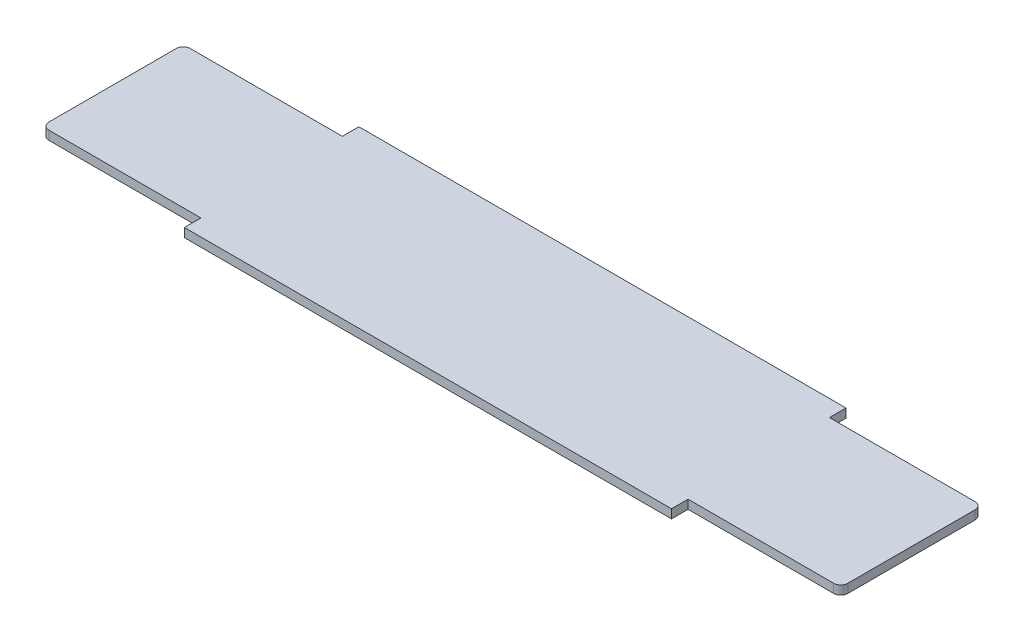
ISO-10303-21;
HEADER;
FILE_DESCRIPTION(('STEP AP214'),'2;1');
FILE_NAME('part.step','',(''),(''),'','','');
FILE_SCHEMA(('AUTOMOTIVE_DESIGN { 1 0 10303 214 1 1 1 1 }'));
ENDSEC;
DATA;
#1=APPLICATION_CONTEXT('core data for automotive mechanical design processes');
#2=APPLICATION_PROTOCOL_DEFINITION('international standard','automotive_design',2000,#1);
#3=PRODUCT_CONTEXT('',#1,'mechanical');
#4=PRODUCT('Part','Part','',(#3));
#5=PRODUCT_RELATED_PRODUCT_CATEGORY('part','',(#4));
#6=PRODUCT_DEFINITION_FORMATION('','',#4);
#7=PRODUCT_DEFINITION_CONTEXT('part definition',#1,'design');
#8=PRODUCT_DEFINITION('design','',#6,#7);
#9=PRODUCT_DEFINITION_SHAPE('','',#8);
#10=(LENGTH_UNIT() NAMED_UNIT(*) SI_UNIT(.MILLI.,.METRE.));
#11=(NAMED_UNIT(*) PLANE_ANGLE_UNIT() SI_UNIT($,.RADIAN.));
#12=(NAMED_UNIT(*) SI_UNIT($,.STERADIAN.) SOLID_ANGLE_UNIT());
#13=UNCERTAINTY_MEASURE_WITH_UNIT(LENGTH_MEASURE(1.E-05),#10,'distance_accuracy_value','');
#14=(GEOMETRIC_REPRESENTATION_CONTEXT(3) GLOBAL_UNCERTAINTY_ASSIGNED_CONTEXT((#13)) GLOBAL_UNIT_ASSIGNED_CONTEXT((#10,
#11,#12)) REPRESENTATION_CONTEXT('',''));
#15=CARTESIAN_POINT('',(0.,0.,0.));
#16=DIRECTION('',(0.,0.,1.));
#17=DIRECTION('',(1.,0.,0.));
#18=AXIS2_PLACEMENT_3D('',#15,#16,#17);
#19=CARTESIAN_POINT('',(0.,3.175,0.));
#20=DIRECTION('',(0.,0.,-1.));
#21=DIRECTION('',(-1.,0.,0.));
#22=AXIS2_PLACEMENT_3D('',#19,#20,#21);
#23=PLANE('',#22);
#24=DIRECTION('',(1.,0.,0.));
#25=VECTOR('',#24,1.);
#26=CARTESIAN_POINT('',(0.,0.,0.));
#27=LINE('',#26,#25);
#28=CARTESIAN_POINT('',(-54.864,0.,0.));
#29=VERTEX_POINT('',#28);
#30=CARTESIAN_POINT('',(-2.54,0.,0.));
#31=VERTEX_POINT('',#30);
#32=EDGE_CURVE('E246',#29,#31,#27,.T.);
#33=ORIENTED_EDGE('',*,*,#32,.T.);
#34=DIRECTION('',(0.,-1.,0.));
#35=VECTOR('',#34,1.);
#36=CARTESIAN_POINT('',(-2.54,3.175,0.));
#37=LINE('',#36,#35);
#38=CARTESIAN_POINT('',(-2.54,3.175,0.));
#39=VERTEX_POINT('',#38);
#40=EDGE_CURVE('E225',#31,#39,#37,.F.);
#41=ORIENTED_EDGE('',*,*,#40,.T.);
#42=DIRECTION('',(1.,0.,0.));
#43=VECTOR('',#42,1.);
#44=CARTESIAN_POINT('',(0.,3.175,0.));
#45=LINE('',#44,#43);
#46=CARTESIAN_POINT('',(-54.864,3.175,0.));
#47=VERTEX_POINT('',#46);
#48=EDGE_CURVE('E209',#47,#39,#45,.T.);
#49=ORIENTED_EDGE('',*,*,#48,.F.);
#50=DIRECTION('',(0.,1.,0.));
#51=VECTOR('',#50,1.);
#52=CARTESIAN_POINT('',(-54.864,-175.10689996959,0.));
#53=LINE('',#52,#51);
#54=EDGE_CURVE('E280',#29,#47,#53,.T.);
#55=ORIENTED_EDGE('',*,*,#54,.F.);
#56=EDGE_LOOP('',(#33,#41,#49,#55));
#57=FACE_BOUND('',#56,.T.);
#58=ADVANCED_FACE('F32',(#57),#23,.F.);
#59=CARTESIAN_POINT('',(0.,3.175,-50.8));
#60=DIRECTION('',(0.,0.,1.));
#61=DIRECTION('',(1.,0.,0.));
#62=AXIS2_PLACEMENT_3D('',#59,#60,#61);
#63=PLANE('',#62);
#64=DIRECTION('',(-1.,0.,0.));
#65=VECTOR('',#64,1.);
#66=CARTESIAN_POINT('',(0.,0.,-50.8));
#67=LINE('',#66,#65);
#68=CARTESIAN_POINT('',(-229.87,0.,-50.8));
#69=VERTEX_POINT('',#68);
#70=CARTESIAN_POINT('',(-284.48,0.,-50.8));
#71=VERTEX_POINT('',#70);
#72=EDGE_CURVE('E184',#69,#71,#67,.T.);
#73=ORIENTED_EDGE('',*,*,#72,.T.);
#74=DIRECTION('',(0.,-1.,0.));
#75=VECTOR('',#74,1.);
#76=CARTESIAN_POINT('',(-284.48,3.175,-50.8));
#77=LINE('',#76,#75);
#78=CARTESIAN_POINT('',(-284.48,3.175,-50.8));
#79=VERTEX_POINT('',#78);
#80=EDGE_CURVE('E11',#71,#79,#77,.F.);
#81=ORIENTED_EDGE('',*,*,#80,.T.);
#82=DIRECTION('',(-1.,0.,0.));
#83=VECTOR('',#82,1.);
#84=CARTESIAN_POINT('',(0.,3.175,-50.8));
#85=LINE('',#84,#83);
#86=CARTESIAN_POINT('',(-229.87,3.175,-50.8));
#87=VERTEX_POINT('',#86);
#88=EDGE_CURVE('E198',#87,#79,#85,.T.);
#89=ORIENTED_EDGE('',*,*,#88,.F.);
#90=DIRECTION('',(0.,1.,0.));
#91=VECTOR('',#90,1.);
#92=CARTESIAN_POINT('',(-229.87,-175.10689996959,-50.8));
#93=LINE('',#92,#91);
#94=EDGE_CURVE('E201',#69,#87,#93,.T.);
#95=ORIENTED_EDGE('',*,*,#94,.F.);
#96=EDGE_LOOP('',(#73,#81,#89,#95));
#97=FACE_BOUND('',#96,.T.);
#98=ADVANCED_FACE('F352',(#97),#63,.F.);
#99=CARTESIAN_POINT('',(0.,3.175,0.));
#100=DIRECTION('',(-1.,0.,0.));
#101=DIRECTION('',(0.,0.,1.));
#102=AXIS2_PLACEMENT_3D('',#99,#100,#101);
#103=PLANE('',#102);
#104=DIRECTION('',(0.,0.,-1.));
#105=VECTOR('',#104,1.);
#106=CARTESIAN_POINT('',(0.,0.,0.));
#107=LINE('',#106,#105);
#108=CARTESIAN_POINT('',(0.,0.,-2.54));
#109=VERTEX_POINT('',#108);
#110=CARTESIAN_POINT('',(0.,0.,-48.26));
#111=VERTEX_POINT('',#110);
#112=EDGE_CURVE('E191',#109,#111,#107,.T.);
#113=ORIENTED_EDGE('',*,*,#112,.T.);
#114=DIRECTION('',(0.,-1.,0.));
#115=VECTOR('',#114,1.);
#116=CARTESIAN_POINT('',(0.,3.175,-48.26));
#117=LINE('',#116,#115);
#118=CARTESIAN_POINT('',(0.,3.175,-48.26));
#119=VERTEX_POINT('',#118);
#120=EDGE_CURVE('E325',#111,#119,#117,.F.);
#121=ORIENTED_EDGE('',*,*,#120,.T.);
#122=DIRECTION('',(0.,0.,-1.));
#123=VECTOR('',#122,1.);
#124=CARTESIAN_POINT('',(0.,3.175,0.));
#125=LINE('',#124,#123);
#126=CARTESIAN_POINT('',(0.,3.175,-2.54));
#127=VERTEX_POINT('',#126);
#128=EDGE_CURVE('E200',#127,#119,#125,.T.);
#129=ORIENTED_EDGE('',*,*,#128,.F.);
#130=DIRECTION('',(0.,-1.,0.));
#131=VECTOR('',#130,1.);
#132=CARTESIAN_POINT('',(0.,3.175,-2.54));
#133=LINE('',#132,#131);
#134=EDGE_CURVE('E322',#127,#109,#133,.T.);
#135=ORIENTED_EDGE('',*,*,#134,.T.);
#136=EDGE_LOOP('',(#113,#121,#129,#135));
#137=FACE_BOUND('',#136,.T.);
#138=ADVANCED_FACE('F340',(#137),#103,.F.);
#139=CARTESIAN_POINT('',(-2.54,3.175,-50.8));
#140=VERTEX_POINT('',#139);
#141=CARTESIAN_POINT('',(-54.864,3.175,-50.8));
#142=VERTEX_POINT('',#141);
#143=EDGE_CURVE('E185',#140,#142,#85,.T.);
#144=ORIENTED_EDGE('',*,*,#143,.F.);
#145=DIRECTION('',(0.,-1.,0.));
#146=VECTOR('',#145,1.);
#147=CARTESIAN_POINT('',(-2.54,3.175,-50.8));
#148=LINE('',#147,#146);
#149=CARTESIAN_POINT('',(-2.54,0.,-50.8));
#150=VERTEX_POINT('',#149);
#151=EDGE_CURVE('E218',#140,#150,#148,.T.);
#152=ORIENTED_EDGE('',*,*,#151,.T.);
#153=CARTESIAN_POINT('',(-54.864,0.,-50.8));
#154=VERTEX_POINT('',#153);
#155=EDGE_CURVE('E180',#150,#154,#67,.T.);
#156=ORIENTED_EDGE('',*,*,#155,.T.);
#157=DIRECTION('',(0.,1.,0.));
#158=VECTOR('',#157,1.);
#159=CARTESIAN_POINT('',(-54.864,-175.10689996959,-50.8));
#160=LINE('',#159,#158);
#161=EDGE_CURVE('E259',#154,#142,#160,.T.);
#162=ORIENTED_EDGE('',*,*,#161,.T.);
#163=EDGE_LOOP('',(#144,#152,#156,#162));
#164=FACE_BOUND('',#163,.T.);
#165=ADVANCED_FACE('F312',(#164),#63,.F.);
#166=CARTESIAN_POINT('',(-287.02,3.175,0.));
#167=DIRECTION('',(1.,0.,0.));
#168=DIRECTION('',(0.,0.,-1.));
#169=AXIS2_PLACEMENT_3D('',#166,#167,#168);
#170=PLANE('',#169);
#171=DIRECTION('',(0.,0.,1.));
#172=VECTOR('',#171,1.);
#173=CARTESIAN_POINT('',(-287.02,0.,0.));
#174=LINE('',#173,#172);
#175=CARTESIAN_POINT('',(-287.02,0.,-48.26));
#176=VERTEX_POINT('',#175);
#177=CARTESIAN_POINT('',(-287.02,0.,-2.53999999999997));
#178=VERTEX_POINT('',#177);
#179=EDGE_CURVE('E183',#176,#178,#174,.T.);
#180=ORIENTED_EDGE('',*,*,#179,.T.);
#181=DIRECTION('',(0.,-1.,0.));
#182=VECTOR('',#181,1.);
#183=CARTESIAN_POINT('',(-287.02,3.175,-2.53999999999997));
#184=LINE('',#183,#182);
#185=CARTESIAN_POINT('',(-287.02,3.175,-2.53999999999997));
#186=VERTEX_POINT('',#185);
#187=EDGE_CURVE('E53',#178,#186,#184,.F.);
#188=ORIENTED_EDGE('',*,*,#187,.T.);
#189=DIRECTION('',(0.,0.,1.));
#190=VECTOR('',#189,1.);
#191=CARTESIAN_POINT('',(-287.02,3.175,0.));
#192=LINE('',#191,#190);
#193=CARTESIAN_POINT('',(-287.02,3.175,-48.26));
#194=VERTEX_POINT('',#193);
#195=EDGE_CURVE('E207',#194,#186,#192,.T.);
#196=ORIENTED_EDGE('',*,*,#195,.F.);
#197=DIRECTION('',(0.,-1.,0.));
#198=VECTOR('',#197,1.);
#199=CARTESIAN_POINT('',(-287.02,3.175,-48.26));
#200=LINE('',#199,#198);
#201=EDGE_CURVE('E229',#194,#176,#200,.T.);
#202=ORIENTED_EDGE('',*,*,#201,.T.);
#203=EDGE_LOOP('',(#180,#188,#196,#202));
#204=FACE_BOUND('',#203,.T.);
#205=ADVANCED_FACE('F244',(#204),#170,.F.);
#206=CARTESIAN_POINT('',(-284.48,3.175,0.));
#207=VERTEX_POINT('',#206);
#208=CARTESIAN_POINT('',(-229.87,3.175,0.));
#209=VERTEX_POINT('',#208);
#210=EDGE_CURVE('E171',#207,#209,#45,.T.);
#211=ORIENTED_EDGE('',*,*,#210,.F.);
#212=DIRECTION('',(0.,-1.,0.));
#213=VECTOR('',#212,1.);
#214=CARTESIAN_POINT('',(-284.48,3.175,0.));
#215=LINE('',#214,#213);
#216=CARTESIAN_POINT('',(-284.48,0.,0.));
#217=VERTEX_POINT('',#216);
#218=EDGE_CURVE('E221',#207,#217,#215,.T.);
#219=ORIENTED_EDGE('',*,*,#218,.T.);
#220=CARTESIAN_POINT('',(-229.87,0.,0.));
#221=VERTEX_POINT('',#220);
#222=EDGE_CURVE('E219',#217,#221,#27,.T.);
#223=ORIENTED_EDGE('',*,*,#222,.T.);
#224=DIRECTION('',(0.,1.,0.));
#225=VECTOR('',#224,1.);
#226=CARTESIAN_POINT('',(-229.87,-175.10689996959,0.));
#227=LINE('',#226,#225);
#228=EDGE_CURVE('E158',#221,#209,#227,.T.);
#229=ORIENTED_EDGE('',*,*,#228,.T.);
#230=EDGE_LOOP('',(#211,#219,#223,#229));
#231=FACE_BOUND('',#230,.T.);
#232=ADVANCED_FACE('F238',(#231),#23,.F.);
#233=CARTESIAN_POINT('',(0.,3.175,0.));
#234=DIRECTION('',(0.,1.,0.));
#235=DIRECTION('',(0.,0.,1.));
#236=AXIS2_PLACEMENT_3D('',#233,#234,#235);
#237=PLANE('',#236);
#238=ORIENTED_EDGE('',*,*,#195,.T.);
#239=CARTESIAN_POINT('',(-284.48,3.175,-2.53999999999997));
#240=DIRECTION('',(0.,1.,0.));
#241=DIRECTION('',(0.,0.,1.));
#242=AXIS2_PLACEMENT_3D('',#239,#240,#241);
#243=CIRCLE('',#242,2.54);
#244=EDGE_CURVE('E40',#186,#207,#243,.T.);
#245=ORIENTED_EDGE('',*,*,#244,.T.);
#246=ORIENTED_EDGE('',*,*,#210,.T.);
#247=DIRECTION('',(0.,0.,1.));
#248=VECTOR('',#247,1.);
#249=CARTESIAN_POINT('',(-229.87,3.175,0.));
#250=LINE('',#249,#248);
#251=CARTESIAN_POINT('',(-229.87,3.175,5.94360000000003));
#252=VERTEX_POINT('',#251);
#253=EDGE_CURVE('E152',#209,#252,#250,.T.);
#254=ORIENTED_EDGE('',*,*,#253,.T.);
#255=DIRECTION('',(1.,0.,0.));
#256=VECTOR('',#255,1.);
#257=CARTESIAN_POINT('',(-229.87,3.175,5.94360000000003));
#258=LINE('',#257,#256);
#259=CARTESIAN_POINT('',(-54.864,3.175,5.94360000000003));
#260=VERTEX_POINT('',#259);
#261=EDGE_CURVE('E161',#252,#260,#258,.T.);
#262=ORIENTED_EDGE('',*,*,#261,.T.);
#263=DIRECTION('',(0.,0.,-1.));
#264=VECTOR('',#263,1.);
#265=CARTESIAN_POINT('',(-54.864,3.175,0.));
#266=LINE('',#265,#264);
#267=EDGE_CURVE('E167',#260,#47,#266,.T.);
#268=ORIENTED_EDGE('',*,*,#267,.T.);
#269=ORIENTED_EDGE('',*,*,#48,.T.);
#270=CARTESIAN_POINT('',(-2.54,3.175,-2.54));
#271=DIRECTION('',(0.,1.,0.));
#272=DIRECTION('',(0.,0.,1.));
#273=AXIS2_PLACEMENT_3D('',#270,#271,#272);
#274=CIRCLE('',#273,2.54);
#275=EDGE_CURVE('E327',#39,#127,#274,.T.);
#276=ORIENTED_EDGE('',*,*,#275,.T.);
#277=ORIENTED_EDGE('',*,*,#128,.T.);
#278=CARTESIAN_POINT('',(-2.54,3.175,-48.26));
#279=DIRECTION('',(0.,1.,0.));
#280=DIRECTION('',(0.,0.,1.));
#281=AXIS2_PLACEMENT_3D('',#278,#279,#280);
#282=CIRCLE('',#281,2.54);
#283=EDGE_CURVE('E329',#119,#140,#282,.T.);
#284=ORIENTED_EDGE('',*,*,#283,.T.);
#285=ORIENTED_EDGE('',*,*,#143,.T.);
#286=DIRECTION('',(0.,0.,-1.));
#287=VECTOR('',#286,1.);
#288=CARTESIAN_POINT('',(-54.864,3.175,-50.8));
#289=LINE('',#288,#287);
#290=CARTESIAN_POINT('',(-54.864,3.175,-56.7436));
#291=VERTEX_POINT('',#290);
#292=EDGE_CURVE('E254',#142,#291,#289,.T.);
#293=ORIENTED_EDGE('',*,*,#292,.T.);
#294=DIRECTION('',(-1.,0.,0.));
#295=VECTOR('',#294,1.);
#296=CARTESIAN_POINT('',(-229.87,3.175,-56.7436));
#297=LINE('',#296,#295);
#298=CARTESIAN_POINT('',(-229.87,3.175,-56.7436));
#299=VERTEX_POINT('',#298);
#300=EDGE_CURVE('E257',#291,#299,#297,.T.);
#301=ORIENTED_EDGE('',*,*,#300,.T.);
#302=DIRECTION('',(0.,0.,1.));
#303=VECTOR('',#302,1.);
#304=CARTESIAN_POINT('',(-229.87,3.175,-50.8));
#305=LINE('',#304,#303);
#306=EDGE_CURVE('E258',#299,#87,#305,.T.);
#307=ORIENTED_EDGE('',*,*,#306,.T.);
#308=ORIENTED_EDGE('',*,*,#88,.T.);
#309=CARTESIAN_POINT('',(-284.48,3.175,-48.26));
#310=DIRECTION('',(0.,1.,0.));
#311=DIRECTION('',(0.,0.,1.));
#312=AXIS2_PLACEMENT_3D('',#309,#310,#311);
#313=CIRCLE('',#312,2.54);
#314=EDGE_CURVE('E233',#79,#194,#313,.T.);
#315=ORIENTED_EDGE('',*,*,#314,.T.);
#316=EDGE_LOOP('',(#238,#245,#246,#254,#262,#268,#269,#276,#277,#284,#285,#293,#301,#307,#308,#315));
#317=FACE_BOUND('',#316,.T.);
#318=ADVANCED_FACE('F169',(#317),#237,.T.);
#319=CARTESIAN_POINT('',(0.,0.,0.));
#320=DIRECTION('',(0.,1.,0.));
#321=DIRECTION('',(0.,0.,1.));
#322=AXIS2_PLACEMENT_3D('',#319,#320,#321);
#323=PLANE('',#322);
#324=ORIENTED_EDGE('',*,*,#222,.F.);
#325=CARTESIAN_POINT('',(-284.48,0.,-2.53999999999997));
#326=DIRECTION('',(0.,1.,0.));
#327=DIRECTION('',(0.,0.,1.));
#328=AXIS2_PLACEMENT_3D('',#325,#326,#327);
#329=CIRCLE('',#328,2.54);
#330=EDGE_CURVE('E227',#217,#178,#329,.F.);
#331=ORIENTED_EDGE('',*,*,#330,.T.);
#332=ORIENTED_EDGE('',*,*,#179,.F.);
#333=CARTESIAN_POINT('',(-284.48,0.,-48.26));
#334=DIRECTION('',(0.,1.,0.));
#335=DIRECTION('',(0.,0.,1.));
#336=AXIS2_PLACEMENT_3D('',#333,#334,#335);
#337=CIRCLE('',#336,2.54);
#338=EDGE_CURVE('E224',#176,#71,#337,.F.);
#339=ORIENTED_EDGE('',*,*,#338,.T.);
#340=ORIENTED_EDGE('',*,*,#72,.F.);
#341=DIRECTION('',(0.,0.,-1.));
#342=VECTOR('',#341,1.);
#343=CARTESIAN_POINT('',(-229.87,0.,-50.8));
#344=LINE('',#343,#342);
#345=CARTESIAN_POINT('',(-229.87,0.,-56.7436));
#346=VERTEX_POINT('',#345);
#347=EDGE_CURVE('E276',#69,#346,#344,.T.);
#348=ORIENTED_EDGE('',*,*,#347,.T.);
#349=DIRECTION('',(1.,0.,0.));
#350=VECTOR('',#349,1.);
#351=CARTESIAN_POINT('',(-229.87,0.,-56.7436));
#352=LINE('',#351,#350);
#353=CARTESIAN_POINT('',(-54.864,0.,-56.7436));
#354=VERTEX_POINT('',#353);
#355=EDGE_CURVE('E275',#346,#354,#352,.T.);
#356=ORIENTED_EDGE('',*,*,#355,.T.);
#357=DIRECTION('',(0.,0.,1.));
#358=VECTOR('',#357,1.);
#359=CARTESIAN_POINT('',(-54.864,0.,-50.8));
#360=LINE('',#359,#358);
#361=EDGE_CURVE('E272',#354,#154,#360,.T.);
#362=ORIENTED_EDGE('',*,*,#361,.T.);
#363=ORIENTED_EDGE('',*,*,#155,.F.);
#364=CARTESIAN_POINT('',(-2.54,0.,-48.26));
#365=DIRECTION('',(0.,1.,0.));
#366=DIRECTION('',(0.,0.,1.));
#367=AXIS2_PLACEMENT_3D('',#364,#365,#366);
#368=CIRCLE('',#367,2.54);
#369=EDGE_CURVE('E318',#150,#111,#368,.F.);
#370=ORIENTED_EDGE('',*,*,#369,.T.);
#371=ORIENTED_EDGE('',*,*,#112,.F.);
#372=CARTESIAN_POINT('',(-2.54,0.,-2.54));
#373=DIRECTION('',(0.,1.,0.));
#374=DIRECTION('',(0.,0.,1.));
#375=AXIS2_PLACEMENT_3D('',#372,#373,#374);
#376=CIRCLE('',#375,2.54);
#377=EDGE_CURVE('E317',#109,#31,#376,.F.);
#378=ORIENTED_EDGE('',*,*,#377,.T.);
#379=ORIENTED_EDGE('',*,*,#32,.F.);
#380=DIRECTION('',(0.,0.,1.));
#381=VECTOR('',#380,1.);
#382=CARTESIAN_POINT('',(-54.864,0.,0.));
#383=LINE('',#382,#381);
#384=CARTESIAN_POINT('',(-54.864,0.,5.94360000000003));
#385=VERTEX_POINT('',#384);
#386=EDGE_CURVE('E289',#29,#385,#383,.T.);
#387=ORIENTED_EDGE('',*,*,#386,.T.);
#388=DIRECTION('',(-1.,0.,0.));
#389=VECTOR('',#388,1.);
#390=CARTESIAN_POINT('',(-229.87,0.,5.94360000000003));
#391=LINE('',#390,#389);
#392=CARTESIAN_POINT('',(-229.87,0.,5.94360000000003));
#393=VERTEX_POINT('',#392);
#394=EDGE_CURVE('E285',#385,#393,#391,.T.);
#395=ORIENTED_EDGE('',*,*,#394,.T.);
#396=DIRECTION('',(0.,0.,-1.));
#397=VECTOR('',#396,1.);
#398=CARTESIAN_POINT('',(-229.87,0.,0.));
#399=LINE('',#398,#397);
#400=EDGE_CURVE('E154',#393,#221,#399,.T.);
#401=ORIENTED_EDGE('',*,*,#400,.T.);
#402=EDGE_LOOP('',(#324,#331,#332,#339,#340,#348,#356,#362,#363,#370,#371,#378,#379,#387,#395,#401));
#403=FACE_BOUND('',#402,.T.);
#404=ADVANCED_FACE('F243',(#403),#323,.F.);
#405=CARTESIAN_POINT('',(-229.87,-175.10689996959,-50.8));
#406=DIRECTION('',(-1.,0.,0.));
#407=DIRECTION('',(0.,0.,1.));
#408=AXIS2_PLACEMENT_3D('',#405,#406,#407);
#409=PLANE('',#408);
#410=ORIENTED_EDGE('',*,*,#347,.F.);
#411=ORIENTED_EDGE('',*,*,#94,.T.);
#412=ORIENTED_EDGE('',*,*,#306,.F.);
#413=DIRECTION('',(0.,1.,0.));
#414=VECTOR('',#413,1.);
#415=CARTESIAN_POINT('',(-229.87,-175.10689996959,-56.7436));
#416=LINE('',#415,#414);
#417=EDGE_CURVE('E270',#346,#299,#416,.T.);
#418=ORIENTED_EDGE('',*,*,#417,.F.);
#419=EDGE_LOOP('',(#410,#411,#412,#418));
#420=FACE_BOUND('',#419,.T.);
#421=ADVANCED_FACE('F350',(#420),#409,.T.);
#422=CARTESIAN_POINT('',(-229.87,-175.10689996959,-56.7436));
#423=DIRECTION('',(0.,0.,-1.));
#424=DIRECTION('',(-1.,0.,0.));
#425=AXIS2_PLACEMENT_3D('',#422,#423,#424);
#426=PLANE('',#425);
#427=ORIENTED_EDGE('',*,*,#355,.F.);
#428=ORIENTED_EDGE('',*,*,#417,.T.);
#429=ORIENTED_EDGE('',*,*,#300,.F.);
#430=DIRECTION('',(0.,1.,0.));
#431=VECTOR('',#430,1.);
#432=CARTESIAN_POINT('',(-54.864,-175.10689996959,-56.7436));
#433=LINE('',#432,#431);
#434=EDGE_CURVE('E263',#354,#291,#433,.T.);
#435=ORIENTED_EDGE('',*,*,#434,.F.);
#436=EDGE_LOOP('',(#427,#428,#429,#435));
#437=FACE_BOUND('',#436,.T.);
#438=ADVANCED_FACE('F345',(#437),#426,.T.);
#439=CARTESIAN_POINT('',(-54.864,-175.10689996959,-50.8));
#440=DIRECTION('',(1.,0.,0.));
#441=DIRECTION('',(0.,0.,-1.));
#442=AXIS2_PLACEMENT_3D('',#439,#440,#441);
#443=PLANE('',#442);
#444=ORIENTED_EDGE('',*,*,#361,.F.);
#445=ORIENTED_EDGE('',*,*,#434,.T.);
#446=ORIENTED_EDGE('',*,*,#292,.F.);
#447=ORIENTED_EDGE('',*,*,#161,.F.);
#448=EDGE_LOOP('',(#444,#445,#446,#447));
#449=FACE_BOUND('',#448,.T.);
#450=ADVANCED_FACE('F309',(#449),#443,.T.);
#451=CARTESIAN_POINT('',(-54.864,-175.10689996959,0.));
#452=DIRECTION('',(1.,0.,0.));
#453=DIRECTION('',(0.,0.,-1.));
#454=AXIS2_PLACEMENT_3D('',#451,#452,#453);
#455=PLANE('',#454);
#456=ORIENTED_EDGE('',*,*,#386,.F.);
#457=ORIENTED_EDGE('',*,*,#54,.T.);
#458=ORIENTED_EDGE('',*,*,#267,.F.);
#459=DIRECTION('',(0.,1.,0.));
#460=VECTOR('',#459,1.);
#461=CARTESIAN_POINT('',(-54.864,-175.10689996959,5.94360000000003));
#462=LINE('',#461,#460);
#463=EDGE_CURVE('E157',#385,#260,#462,.T.);
#464=ORIENTED_EDGE('',*,*,#463,.F.);
#465=EDGE_LOOP('',(#456,#457,#458,#464));
#466=FACE_BOUND('',#465,.T.);
#467=ADVANCED_FACE('F461',(#466),#455,.T.);
#468=CARTESIAN_POINT('',(-229.87,-175.10689996959,5.94360000000003));
#469=DIRECTION('',(0.,0.,1.));
#470=DIRECTION('',(1.,0.,0.));
#471=AXIS2_PLACEMENT_3D('',#468,#469,#470);
#472=PLANE('',#471);
#473=ORIENTED_EDGE('',*,*,#394,.F.);
#474=ORIENTED_EDGE('',*,*,#463,.T.);
#475=ORIENTED_EDGE('',*,*,#261,.F.);
#476=DIRECTION('',(0.,1.,0.));
#477=VECTOR('',#476,1.);
#478=CARTESIAN_POINT('',(-229.87,-175.10689996959,5.94360000000003));
#479=LINE('',#478,#477);
#480=EDGE_CURVE('E147',#393,#252,#479,.T.);
#481=ORIENTED_EDGE('',*,*,#480,.F.);
#482=EDGE_LOOP('',(#473,#474,#475,#481));
#483=FACE_BOUND('',#482,.T.);
#484=ADVANCED_FACE('F162',(#483),#472,.T.);
#485=CARTESIAN_POINT('',(-229.87,-175.10689996959,0.));
#486=DIRECTION('',(-1.,0.,0.));
#487=DIRECTION('',(0.,0.,1.));
#488=AXIS2_PLACEMENT_3D('',#485,#486,#487);
#489=PLANE('',#488);
#490=ORIENTED_EDGE('',*,*,#400,.F.);
#491=ORIENTED_EDGE('',*,*,#480,.T.);
#492=ORIENTED_EDGE('',*,*,#253,.F.);
#493=ORIENTED_EDGE('',*,*,#228,.F.);
#494=EDGE_LOOP('',(#490,#491,#492,#493));
#495=FACE_BOUND('',#494,.T.);
#496=ADVANCED_FACE('F149',(#495),#489,.T.);
#497=CARTESIAN_POINT('',(-2.54,3.175,-48.26));
#498=DIRECTION('',(0.,-1.,0.));
#499=DIRECTION('',(0.,0.,-1.));
#500=AXIS2_PLACEMENT_3D('',#497,#498,#499);
#501=CYLINDRICAL_SURFACE('',#500,2.54);
#502=ORIENTED_EDGE('',*,*,#283,.F.);
#503=ORIENTED_EDGE('',*,*,#120,.F.);
#504=ORIENTED_EDGE('',*,*,#369,.F.);
#505=ORIENTED_EDGE('',*,*,#151,.F.);
#506=EDGE_LOOP('',(#502,#503,#504,#505));
#507=FACE_BOUND('',#506,.T.);
#508=ADVANCED_FACE('F342',(#507),#501,.T.);
#509=CARTESIAN_POINT('',(-2.54,3.175,-2.54));
#510=DIRECTION('',(0.,-1.,0.));
#511=DIRECTION('',(0.,0.,-1.));
#512=AXIS2_PLACEMENT_3D('',#509,#510,#511);
#513=CYLINDRICAL_SURFACE('',#512,2.54);
#514=ORIENTED_EDGE('',*,*,#275,.F.);
#515=ORIENTED_EDGE('',*,*,#40,.F.);
#516=ORIENTED_EDGE('',*,*,#377,.F.);
#517=ORIENTED_EDGE('',*,*,#134,.F.);
#518=EDGE_LOOP('',(#514,#515,#516,#517));
#519=FACE_BOUND('',#518,.T.);
#520=ADVANCED_FACE('F336',(#519),#513,.T.);
#521=CARTESIAN_POINT('',(-284.48,3.175,-2.53999999999997));
#522=DIRECTION('',(0.,-1.,0.));
#523=DIRECTION('',(0.,0.,-1.));
#524=AXIS2_PLACEMENT_3D('',#521,#522,#523);
#525=CYLINDRICAL_SURFACE('',#524,2.54);
#526=ORIENTED_EDGE('',*,*,#244,.F.);
#527=ORIENTED_EDGE('',*,*,#187,.F.);
#528=ORIENTED_EDGE('',*,*,#330,.F.);
#529=ORIENTED_EDGE('',*,*,#218,.F.);
#530=EDGE_LOOP('',(#526,#527,#528,#529));
#531=FACE_BOUND('',#530,.T.);
#532=ADVANCED_FACE('F240',(#531),#525,.T.);
#533=CARTESIAN_POINT('',(-284.48,3.175,-48.26));
#534=DIRECTION('',(0.,-1.,0.));
#535=DIRECTION('',(0.,0.,-1.));
#536=AXIS2_PLACEMENT_3D('',#533,#534,#535);
#537=CYLINDRICAL_SURFACE('',#536,2.54);
#538=ORIENTED_EDGE('',*,*,#314,.F.);
#539=ORIENTED_EDGE('',*,*,#80,.F.);
#540=ORIENTED_EDGE('',*,*,#338,.F.);
#541=ORIENTED_EDGE('',*,*,#201,.F.);
#542=EDGE_LOOP('',(#538,#539,#540,#541));
#543=FACE_BOUND('',#542,.T.);
#544=ADVANCED_FACE('F34',(#543),#537,.T.);
#545=CLOSED_SHELL('',(#58,#98,#138,#165,#205,#232,#318,#404,#421,#438,#450,#467,#484,#496,#508,
#520,#532,#544));
#546=MANIFOLD_SOLID_BREP('B2',#545);
#547=ADVANCED_BREP_SHAPE_REPRESENTATION('',(#18,#546),#14);
#548=SHAPE_DEFINITION_REPRESENTATION(#9,#547);
ENDSEC;
END-ISO-10303-21;
